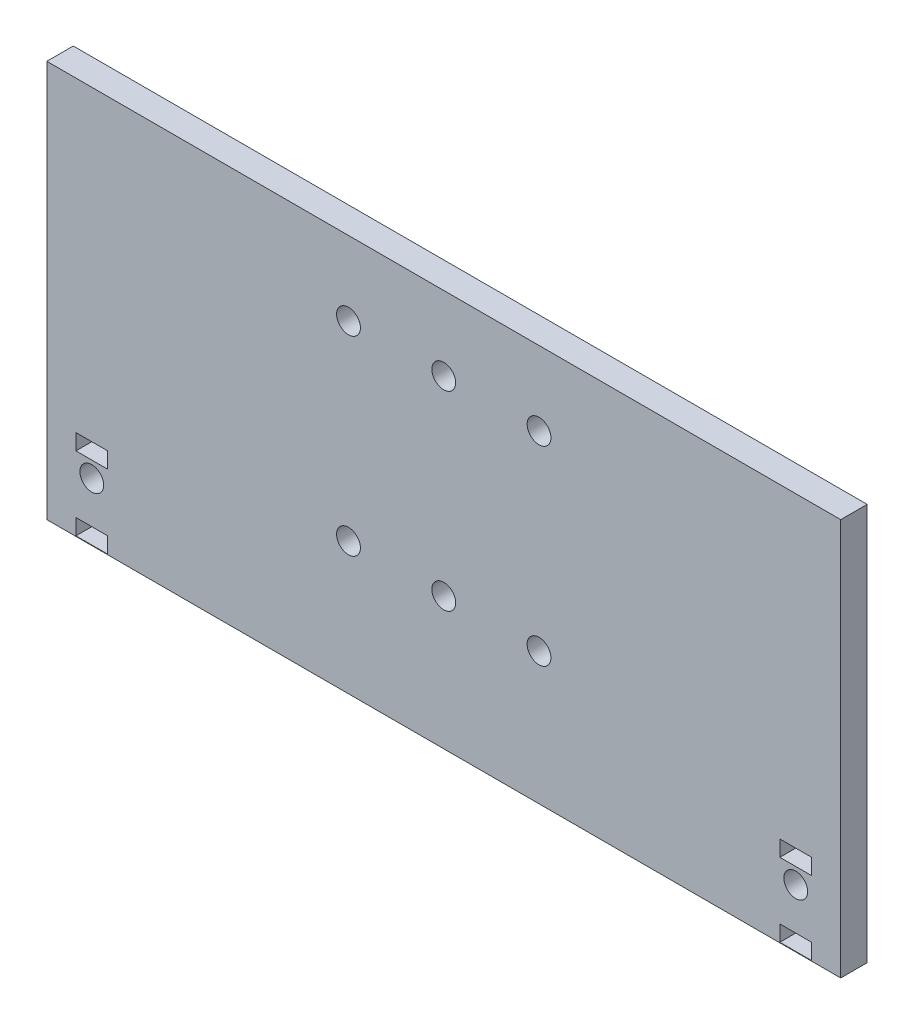
ISO-10303-21;
HEADER;
FILE_DESCRIPTION(('STEP AP214'),'2;1');
FILE_NAME('part.step','',(''),(''),'','','');
FILE_SCHEMA(('AUTOMOTIVE_DESIGN { 1 0 10303 214 1 1 1 1 }'));
ENDSEC;
DATA;
#1=APPLICATION_CONTEXT('core data for automotive mechanical design processes');
#2=APPLICATION_PROTOCOL_DEFINITION('international standard','automotive_design',2000,#1);
#3=PRODUCT_CONTEXT('',#1,'mechanical');
#4=PRODUCT('Part','Part','',(#3));
#5=PRODUCT_RELATED_PRODUCT_CATEGORY('part','',(#4));
#6=PRODUCT_DEFINITION_FORMATION('','',#4);
#7=PRODUCT_DEFINITION_CONTEXT('part definition',#1,'design');
#8=PRODUCT_DEFINITION('design','',#6,#7);
#9=PRODUCT_DEFINITION_SHAPE('','',#8);
#10=(LENGTH_UNIT() NAMED_UNIT(*) SI_UNIT(.MILLI.,.METRE.));
#11=(NAMED_UNIT(*) PLANE_ANGLE_UNIT() SI_UNIT($,.RADIAN.));
#12=(NAMED_UNIT(*) SI_UNIT($,.STERADIAN.) SOLID_ANGLE_UNIT());
#13=UNCERTAINTY_MEASURE_WITH_UNIT(LENGTH_MEASURE(1.E-05),#10,'distance_accuracy_value','');
#14=(GEOMETRIC_REPRESENTATION_CONTEXT(3) GLOBAL_UNCERTAINTY_ASSIGNED_CONTEXT((#13)) GLOBAL_UNIT_ASSIGNED_CONTEXT((#10,
#11,#12)) REPRESENTATION_CONTEXT('',''));
#15=CARTESIAN_POINT('',(0.,0.,0.));
#16=DIRECTION('',(0.,0.,1.));
#17=DIRECTION('',(1.,0.,0.));
#18=AXIS2_PLACEMENT_3D('',#15,#16,#17);
#19=CARTESIAN_POINT('',(0.,0.,5.));
#20=DIRECTION('',(0.,0.,1.));
#21=DIRECTION('',(1.,0.,0.));
#22=AXIS2_PLACEMENT_3D('',#19,#20,#21);
#23=PLANE('',#22);
#24=CARTESIAN_POINT('',(57.,-50.,5.));
#25=DIRECTION('',(0.,0.,1.));
#26=DIRECTION('',(1.,0.,0.));
#27=AXIS2_PLACEMENT_3D('',#24,#25,#26);
#28=CIRCLE('',#27,2.25);
#29=CARTESIAN_POINT('',(59.25,-50.,5.));
#30=VERTEX_POINT('',#29);
#31=EDGE_CURVE('E399',#30,#30,#28,.T.);
#32=ORIENTED_EDGE('',*,*,#31,.F.);
#33=EDGE_LOOP('',(#32));
#34=FACE_BOUND('',#33,.T.);
#35=CARTESIAN_POINT('',(93.,-14.,5.));
#36=DIRECTION('',(0.,0.,1.));
#37=DIRECTION('',(1.,0.,0.));
#38=AXIS2_PLACEMENT_3D('',#35,#36,#37);
#39=CIRCLE('',#38,2.25);
#40=CARTESIAN_POINT('',(95.25,-14.,5.));
#41=VERTEX_POINT('',#40);
#42=EDGE_CURVE('E400',#41,#41,#39,.T.);
#43=ORIENTED_EDGE('',*,*,#42,.F.);
#44=EDGE_LOOP('',(#43));
#45=FACE_BOUND('',#44,.T.);
#46=CARTESIAN_POINT('',(141.5,-64.,5.));
#47=DIRECTION('',(0.,0.,1.));
#48=DIRECTION('',(1.,0.,0.));
#49=AXIS2_PLACEMENT_3D('',#46,#47,#48);
#50=CIRCLE('',#49,2.25000000000001);
#51=CARTESIAN_POINT('',(143.75,-64.,5.));
#52=VERTEX_POINT('',#51);
#53=EDGE_CURVE('E413',#52,#52,#50,.T.);
#54=ORIENTED_EDGE('',*,*,#53,.F.);
#55=EDGE_LOOP('',(#54));
#56=FACE_BOUND('',#55,.T.);
#57=CARTESIAN_POINT('',(75.,-14.,5.));
#58=DIRECTION('',(0.,0.,1.));
#59=DIRECTION('',(1.,0.,0.));
#60=AXIS2_PLACEMENT_3D('',#57,#58,#59);
#61=CIRCLE('',#60,2.25);
#62=CARTESIAN_POINT('',(77.25,-14.,5.));
#63=VERTEX_POINT('',#62);
#64=EDGE_CURVE('E449',#63,#63,#61,.T.);
#65=ORIENTED_EDGE('',*,*,#64,.F.);
#66=EDGE_LOOP('',(#65));
#67=FACE_BOUND('',#66,.T.);
#68=DIRECTION('',(0.,-1.,0.));
#69=VECTOR('',#68,1.);
#70=CARTESIAN_POINT('',(0.,0.,5.));
#71=LINE('',#70,#69);
#72=CARTESIAN_POINT('',(0.,0.,5.));
#73=VERTEX_POINT('',#72);
#74=CARTESIAN_POINT('',(0.,-75.,5.));
#75=VERTEX_POINT('',#74);
#76=EDGE_CURVE('E458',#73,#75,#71,.T.);
#77=ORIENTED_EDGE('',*,*,#76,.T.);
#78=DIRECTION('',(1.,0.,0.));
#79=VECTOR('',#78,1.);
#80=CARTESIAN_POINT('',(0.,-75.,5.));
#81=LINE('',#80,#79);
#82=CARTESIAN_POINT('',(150.,-75.,5.));
#83=VERTEX_POINT('',#82);
#84=EDGE_CURVE('E489',#75,#83,#81,.T.);
#85=ORIENTED_EDGE('',*,*,#84,.T.);
#86=DIRECTION('',(0.,1.,0.));
#87=VECTOR('',#86,1.);
#88=CARTESIAN_POINT('',(150.,0.,5.));
#89=LINE('',#88,#87);
#90=CARTESIAN_POINT('',(150.,0.,5.));
#91=VERTEX_POINT('',#90);
#92=EDGE_CURVE('E441',#83,#91,#89,.T.);
#93=ORIENTED_EDGE('',*,*,#92,.T.);
#94=DIRECTION('',(-1.,0.,0.));
#95=VECTOR('',#94,1.);
#96=CARTESIAN_POINT('',(0.,0.,5.));
#97=LINE('',#96,#95);
#98=EDGE_CURVE('E436',#91,#73,#97,.T.);
#99=ORIENTED_EDGE('',*,*,#98,.T.);
#100=EDGE_LOOP('',(#77,#85,#93,#99));
#101=FACE_BOUND('',#100,.T.);
#102=CARTESIAN_POINT('',(8.50000000000001,-64.,5.));
#103=DIRECTION('',(0.,0.,1.));
#104=DIRECTION('',(1.,0.,0.));
#105=AXIS2_PLACEMENT_3D('',#102,#103,#104);
#106=CIRCLE('',#105,2.25000000000001);
#107=CARTESIAN_POINT('',(10.75,-64.,5.));
#108=VERTEX_POINT('',#107);
#109=EDGE_CURVE('E425',#108,#108,#106,.T.);
#110=ORIENTED_EDGE('',*,*,#109,.F.);
#111=EDGE_LOOP('',(#110));
#112=FACE_BOUND('',#111,.T.);
#113=CARTESIAN_POINT('',(57.,-14.,5.));
#114=DIRECTION('',(0.,0.,1.));
#115=DIRECTION('',(1.,0.,0.));
#116=AXIS2_PLACEMENT_3D('',#113,#114,#115);
#117=CIRCLE('',#116,2.25);
#118=CARTESIAN_POINT('',(59.25,-14.,5.));
#119=VERTEX_POINT('',#118);
#120=EDGE_CURVE('E424',#119,#119,#117,.T.);
#121=ORIENTED_EDGE('',*,*,#120,.F.);
#122=EDGE_LOOP('',(#121));
#123=FACE_BOUND('',#122,.T.);
#124=CARTESIAN_POINT('',(93.,-50.,5.));
#125=DIRECTION('',(0.,0.,1.));
#126=DIRECTION('',(1.,0.,0.));
#127=AXIS2_PLACEMENT_3D('',#124,#125,#126);
#128=CIRCLE('',#127,2.25);
#129=CARTESIAN_POINT('',(95.25,-50.,5.));
#130=VERTEX_POINT('',#129);
#131=EDGE_CURVE('E388',#130,#130,#128,.T.);
#132=ORIENTED_EDGE('',*,*,#131,.F.);
#133=EDGE_LOOP('',(#132));
#134=FACE_BOUND('',#133,.T.);
#135=CARTESIAN_POINT('',(75.,-50.,5.));
#136=DIRECTION('',(0.,0.,1.));
#137=DIRECTION('',(1.,0.,0.));
#138=AXIS2_PLACEMENT_3D('',#135,#136,#137);
#139=CIRCLE('',#138,2.25);
#140=CARTESIAN_POINT('',(77.25,-50.,5.));
#141=VERTEX_POINT('',#140);
#142=EDGE_CURVE('E376',#141,#141,#139,.T.);
#143=ORIENTED_EDGE('',*,*,#142,.F.);
#144=EDGE_LOOP('',(#143));
#145=FACE_BOUND('',#144,.T.);
#146=DIRECTION('',(1.,0.,0.));
#147=VECTOR('',#146,1.);
#148=CARTESIAN_POINT('',(5.50000000000001,-61.,5.));
#149=LINE('',#148,#147);
#150=CARTESIAN_POINT('',(5.50000000000001,-61.,5.));
#151=VERTEX_POINT('',#150);
#152=CARTESIAN_POINT('',(11.5,-61.,5.));
#153=VERTEX_POINT('',#152);
#154=EDGE_CURVE('E332',#151,#153,#149,.T.);
#155=ORIENTED_EDGE('',*,*,#154,.F.);
#156=DIRECTION('',(0.,-1.,0.));
#157=VECTOR('',#156,1.);
#158=CARTESIAN_POINT('',(5.50000000000001,-58.,5.));
#159=LINE('',#158,#157);
#160=CARTESIAN_POINT('',(5.50000000000001,-58.,5.));
#161=VERTEX_POINT('',#160);
#162=EDGE_CURVE('E328',#161,#151,#159,.T.);
#163=ORIENTED_EDGE('',*,*,#162,.F.);
#164=DIRECTION('',(-1.,0.,0.));
#165=VECTOR('',#164,1.);
#166=CARTESIAN_POINT('',(5.50000000000001,-58.,5.));
#167=LINE('',#166,#165);
#168=CARTESIAN_POINT('',(11.5,-58.,5.));
#169=VERTEX_POINT('',#168);
#170=EDGE_CURVE('E341',#169,#161,#167,.T.);
#171=ORIENTED_EDGE('',*,*,#170,.F.);
#172=DIRECTION('',(0.,1.,0.));
#173=VECTOR('',#172,1.);
#174=CARTESIAN_POINT('',(11.5,-58.,5.));
#175=LINE('',#174,#173);
#176=EDGE_CURVE('E346',#153,#169,#175,.T.);
#177=ORIENTED_EDGE('',*,*,#176,.F.);
#178=EDGE_LOOP('',(#155,#163,#171,#177));
#179=FACE_BOUND('',#178,.T.);
#180=DIRECTION('',(1.,0.,0.));
#181=VECTOR('',#180,1.);
#182=CARTESIAN_POINT('',(5.50000000000001,-74.9,5.));
#183=LINE('',#182,#181);
#184=CARTESIAN_POINT('',(5.50000000000001,-74.9,5.));
#185=VERTEX_POINT('',#184);
#186=CARTESIAN_POINT('',(11.5,-74.9,5.));
#187=VERTEX_POINT('',#186);
#188=EDGE_CURVE('E284',#185,#187,#183,.T.);
#189=ORIENTED_EDGE('',*,*,#188,.F.);
#190=DIRECTION('',(0.,-1.,0.));
#191=VECTOR('',#190,1.);
#192=CARTESIAN_POINT('',(5.50000000000001,-71.9,5.));
#193=LINE('',#192,#191);
#194=CARTESIAN_POINT('',(5.50000000000001,-71.9,5.));
#195=VERTEX_POINT('',#194);
#196=EDGE_CURVE('E280',#195,#185,#193,.T.);
#197=ORIENTED_EDGE('',*,*,#196,.F.);
#198=DIRECTION('',(-1.,0.,0.));
#199=VECTOR('',#198,1.);
#200=CARTESIAN_POINT('',(5.50000000000001,-71.9,5.));
#201=LINE('',#200,#199);
#202=CARTESIAN_POINT('',(11.5,-71.9,5.));
#203=VERTEX_POINT('',#202);
#204=EDGE_CURVE('E293',#203,#195,#201,.T.);
#205=ORIENTED_EDGE('',*,*,#204,.F.);
#206=DIRECTION('',(0.,1.,0.));
#207=VECTOR('',#206,1.);
#208=CARTESIAN_POINT('',(11.5,-71.9,5.));
#209=LINE('',#208,#207);
#210=EDGE_CURVE('E298',#187,#203,#209,.T.);
#211=ORIENTED_EDGE('',*,*,#210,.F.);
#212=EDGE_LOOP('',(#189,#197,#205,#211));
#213=FACE_BOUND('',#212,.T.);
#214=DIRECTION('',(1.,0.,0.));
#215=VECTOR('',#214,1.);
#216=CARTESIAN_POINT('',(138.5,-61.,5.));
#217=LINE('',#216,#215);
#218=CARTESIAN_POINT('',(138.5,-61.,5.));
#219=VERTEX_POINT('',#218);
#220=CARTESIAN_POINT('',(144.5,-61.,5.));
#221=VERTEX_POINT('',#220);
#222=EDGE_CURVE('E238',#219,#221,#217,.T.);
#223=ORIENTED_EDGE('',*,*,#222,.F.);
#224=DIRECTION('',(0.,-1.,0.));
#225=VECTOR('',#224,1.);
#226=CARTESIAN_POINT('',(138.5,-58.,5.));
#227=LINE('',#226,#225);
#228=CARTESIAN_POINT('',(138.5,-58.,5.));
#229=VERTEX_POINT('',#228);
#230=EDGE_CURVE('E234',#229,#219,#227,.T.);
#231=ORIENTED_EDGE('',*,*,#230,.F.);
#232=DIRECTION('',(-1.,0.,0.));
#233=VECTOR('',#232,1.);
#234=CARTESIAN_POINT('',(138.5,-58.,5.));
#235=LINE('',#234,#233);
#236=CARTESIAN_POINT('',(144.5,-58.,5.));
#237=VERTEX_POINT('',#236);
#238=EDGE_CURVE('E245',#237,#229,#235,.T.);
#239=ORIENTED_EDGE('',*,*,#238,.F.);
#240=DIRECTION('',(0.,1.,0.));
#241=VECTOR('',#240,1.);
#242=CARTESIAN_POINT('',(144.5,-58.,5.));
#243=LINE('',#242,#241);
#244=EDGE_CURVE('E250',#221,#237,#243,.T.);
#245=ORIENTED_EDGE('',*,*,#244,.F.);
#246=EDGE_LOOP('',(#223,#231,#239,#245));
#247=FACE_BOUND('',#246,.T.);
#248=DIRECTION('',(1.,0.,0.));
#249=VECTOR('',#248,1.);
#250=CARTESIAN_POINT('',(138.5,-74.9,5.));
#251=LINE('',#250,#249);
#252=CARTESIAN_POINT('',(138.5,-74.9,5.));
#253=VERTEX_POINT('',#252);
#254=CARTESIAN_POINT('',(144.5,-74.9,5.));
#255=VERTEX_POINT('',#254);
#256=EDGE_CURVE('E187',#253,#255,#251,.T.);
#257=ORIENTED_EDGE('',*,*,#256,.F.);
#258=DIRECTION('',(0.,-1.,0.));
#259=VECTOR('',#258,1.);
#260=CARTESIAN_POINT('',(138.5,-71.9,5.));
#261=LINE('',#260,#259);
#262=CARTESIAN_POINT('',(138.5,-71.9,5.));
#263=VERTEX_POINT('',#262);
#264=EDGE_CURVE('E178',#263,#253,#261,.T.);
#265=ORIENTED_EDGE('',*,*,#264,.F.);
#266=DIRECTION('',(-1.,0.,0.));
#267=VECTOR('',#266,1.);
#268=CARTESIAN_POINT('',(138.5,-71.9,5.));
#269=LINE('',#268,#267);
#270=CARTESIAN_POINT('',(144.5,-71.9,5.));
#271=VERTEX_POINT('',#270);
#272=EDGE_CURVE('E204',#271,#263,#269,.T.);
#273=ORIENTED_EDGE('',*,*,#272,.F.);
#274=DIRECTION('',(0.,1.,0.));
#275=VECTOR('',#274,1.);
#276=CARTESIAN_POINT('',(144.5,-71.9,5.));
#277=LINE('',#276,#275);
#278=EDGE_CURVE('E200',#255,#271,#277,.T.);
#279=ORIENTED_EDGE('',*,*,#278,.F.);
#280=EDGE_LOOP('',(#257,#265,#273,#279));
#281=FACE_BOUND('',#280,.T.);
#282=ADVANCED_FACE('F40',(#34,#45,#56,#67,#101,#112,#123,#134,#145,#179,#213,#247,#281),#23,.T.);
#283=CARTESIAN_POINT('',(0.,0.,0.));
#284=DIRECTION('',(0.,0.,1.));
#285=DIRECTION('',(1.,0.,0.));
#286=AXIS2_PLACEMENT_3D('',#283,#284,#285);
#287=PLANE('',#286);
#288=DIRECTION('',(0.,-1.,0.));
#289=VECTOR('',#288,1.);
#290=CARTESIAN_POINT('',(138.5,-58.,0.));
#291=LINE('',#290,#289);
#292=CARTESIAN_POINT('',(138.5,-58.,0.));
#293=VERTEX_POINT('',#292);
#294=CARTESIAN_POINT('',(138.5,-61.,0.));
#295=VERTEX_POINT('',#294);
#296=EDGE_CURVE('E196',#293,#295,#291,.T.);
#297=ORIENTED_EDGE('',*,*,#296,.T.);
#298=DIRECTION('',(1.,0.,0.));
#299=VECTOR('',#298,1.);
#300=CARTESIAN_POINT('',(138.5,-61.,0.));
#301=LINE('',#300,#299);
#302=CARTESIAN_POINT('',(144.5,-61.,0.));
#303=VERTEX_POINT('',#302);
#304=EDGE_CURVE('E255',#295,#303,#301,.T.);
#305=ORIENTED_EDGE('',*,*,#304,.T.);
#306=DIRECTION('',(0.,1.,0.));
#307=VECTOR('',#306,1.);
#308=CARTESIAN_POINT('',(144.5,-58.,0.));
#309=LINE('',#308,#307);
#310=CARTESIAN_POINT('',(144.5,-58.,0.));
#311=VERTEX_POINT('',#310);
#312=EDGE_CURVE('E259',#303,#311,#309,.T.);
#313=ORIENTED_EDGE('',*,*,#312,.T.);
#314=DIRECTION('',(-1.,0.,0.));
#315=VECTOR('',#314,1.);
#316=CARTESIAN_POINT('',(138.5,-58.,0.));
#317=LINE('',#316,#315);
#318=EDGE_CURVE('E239',#311,#293,#317,.T.);
#319=ORIENTED_EDGE('',*,*,#318,.T.);
#320=EDGE_LOOP('',(#297,#305,#313,#319));
#321=FACE_BOUND('',#320,.T.);
#322=DIRECTION('',(0.,-1.,0.));
#323=VECTOR('',#322,1.);
#324=CARTESIAN_POINT('',(5.50000000000001,-58.,0.));
#325=LINE('',#324,#323);
#326=CARTESIAN_POINT('',(5.50000000000001,-58.,0.));
#327=VERTEX_POINT('',#326);
#328=CARTESIAN_POINT('',(5.50000000000001,-61.,0.));
#329=VERTEX_POINT('',#328);
#330=EDGE_CURVE('E327',#327,#329,#325,.T.);
#331=ORIENTED_EDGE('',*,*,#330,.T.);
#332=DIRECTION('',(1.,0.,0.));
#333=VECTOR('',#332,1.);
#334=CARTESIAN_POINT('',(5.50000000000001,-61.,0.));
#335=LINE('',#334,#333);
#336=CARTESIAN_POINT('',(11.5,-61.,0.));
#337=VERTEX_POINT('',#336);
#338=EDGE_CURVE('E351',#329,#337,#335,.T.);
#339=ORIENTED_EDGE('',*,*,#338,.T.);
#340=DIRECTION('',(0.,1.,0.));
#341=VECTOR('',#340,1.);
#342=CARTESIAN_POINT('',(11.5,-58.,0.));
#343=LINE('',#342,#341);
#344=CARTESIAN_POINT('',(11.5,-58.,0.));
#345=VERTEX_POINT('',#344);
#346=EDGE_CURVE('E355',#337,#345,#343,.T.);
#347=ORIENTED_EDGE('',*,*,#346,.T.);
#348=DIRECTION('',(-1.,0.,0.));
#349=VECTOR('',#348,1.);
#350=CARTESIAN_POINT('',(5.50000000000001,-58.,0.));
#351=LINE('',#350,#349);
#352=EDGE_CURVE('E333',#345,#327,#351,.T.);
#353=ORIENTED_EDGE('',*,*,#352,.T.);
#354=EDGE_LOOP('',(#331,#339,#347,#353));
#355=FACE_BOUND('',#354,.T.);
#356=DIRECTION('',(0.,-1.,0.));
#357=VECTOR('',#356,1.);
#358=CARTESIAN_POINT('',(0.,0.,0.));
#359=LINE('',#358,#357);
#360=CARTESIAN_POINT('',(0.,0.,0.));
#361=VERTEX_POINT('',#360);
#362=CARTESIAN_POINT('',(0.,-75.,0.));
#363=VERTEX_POINT('',#362);
#364=EDGE_CURVE('E444',#361,#363,#359,.T.);
#365=ORIENTED_EDGE('',*,*,#364,.F.);
#366=DIRECTION('',(-1.,0.,0.));
#367=VECTOR('',#366,1.);
#368=CARTESIAN_POINT('',(0.,0.,0.));
#369=LINE('',#368,#367);
#370=CARTESIAN_POINT('',(150.,0.,0.));
#371=VERTEX_POINT('',#370);
#372=EDGE_CURVE('E455',#371,#361,#369,.T.);
#373=ORIENTED_EDGE('',*,*,#372,.F.);
#374=DIRECTION('',(0.,1.,0.));
#375=VECTOR('',#374,1.);
#376=CARTESIAN_POINT('',(150.,0.,0.));
#377=LINE('',#376,#375);
#378=CARTESIAN_POINT('',(150.,-75.,0.));
#379=VERTEX_POINT('',#378);
#380=EDGE_CURVE('E452',#379,#371,#377,.T.);
#381=ORIENTED_EDGE('',*,*,#380,.F.);
#382=DIRECTION('',(1.,0.,0.));
#383=VECTOR('',#382,1.);
#384=CARTESIAN_POINT('',(0.,-75.,0.));
#385=LINE('',#384,#383);
#386=EDGE_CURVE('E448',#363,#379,#385,.T.);
#387=ORIENTED_EDGE('',*,*,#386,.F.);
#388=EDGE_LOOP('',(#365,#373,#381,#387));
#389=FACE_BOUND('',#388,.T.);
#390=CARTESIAN_POINT('',(75.,-14.,0.));
#391=DIRECTION('',(0.,0.,1.));
#392=DIRECTION('',(1.,0.,0.));
#393=AXIS2_PLACEMENT_3D('',#390,#391,#392);
#394=CIRCLE('',#393,2.25);
#395=CARTESIAN_POINT('',(77.25,-14.,0.));
#396=VERTEX_POINT('',#395);
#397=EDGE_CURVE('E430',#396,#396,#394,.T.);
#398=ORIENTED_EDGE('',*,*,#397,.T.);
#399=EDGE_LOOP('',(#398));
#400=FACE_BOUND('',#399,.T.);
#401=CARTESIAN_POINT('',(8.50000000000001,-64.,0.));
#402=DIRECTION('',(0.,0.,1.));
#403=DIRECTION('',(1.,0.,0.));
#404=AXIS2_PLACEMENT_3D('',#401,#402,#403);
#405=CIRCLE('',#404,2.25000000000001);
#406=CARTESIAN_POINT('',(10.75,-64.,0.));
#407=VERTEX_POINT('',#406);
#408=EDGE_CURVE('E419',#407,#407,#405,.T.);
#409=ORIENTED_EDGE('',*,*,#408,.T.);
#410=EDGE_LOOP('',(#409));
#411=FACE_BOUND('',#410,.T.);
#412=CARTESIAN_POINT('',(141.5,-64.,0.));
#413=DIRECTION('',(0.,0.,1.));
#414=DIRECTION('',(1.,0.,0.));
#415=AXIS2_PLACEMENT_3D('',#412,#413,#414);
#416=CIRCLE('',#415,2.25000000000001);
#417=CARTESIAN_POINT('',(143.75,-64.,0.));
#418=VERTEX_POINT('',#417);
#419=EDGE_CURVE('E420',#418,#418,#416,.T.);
#420=ORIENTED_EDGE('',*,*,#419,.T.);
#421=EDGE_LOOP('',(#420));
#422=FACE_BOUND('',#421,.T.);
#423=CARTESIAN_POINT('',(57.,-14.,0.));
#424=DIRECTION('',(0.,0.,1.));
#425=DIRECTION('',(1.,0.,0.));
#426=AXIS2_PLACEMENT_3D('',#423,#424,#425);
#427=CIRCLE('',#426,2.25);
#428=CARTESIAN_POINT('',(59.25,-14.,0.));
#429=VERTEX_POINT('',#428);
#430=EDGE_CURVE('E405',#429,#429,#427,.T.);
#431=ORIENTED_EDGE('',*,*,#430,.T.);
#432=EDGE_LOOP('',(#431));
#433=FACE_BOUND('',#432,.T.);
#434=CARTESIAN_POINT('',(93.,-14.,0.));
#435=DIRECTION('',(0.,0.,1.));
#436=DIRECTION('',(1.,0.,0.));
#437=AXIS2_PLACEMENT_3D('',#434,#435,#436);
#438=CIRCLE('',#437,2.25);
#439=CARTESIAN_POINT('',(95.25,-14.,0.));
#440=VERTEX_POINT('',#439);
#441=EDGE_CURVE('E394',#440,#440,#438,.T.);
#442=ORIENTED_EDGE('',*,*,#441,.T.);
#443=EDGE_LOOP('',(#442));
#444=FACE_BOUND('',#443,.T.);
#445=CARTESIAN_POINT('',(93.,-50.,0.));
#446=DIRECTION('',(0.,0.,1.));
#447=DIRECTION('',(1.,0.,0.));
#448=AXIS2_PLACEMENT_3D('',#445,#446,#447);
#449=CIRCLE('',#448,2.25);
#450=CARTESIAN_POINT('',(95.25,-50.,0.));
#451=VERTEX_POINT('',#450);
#452=EDGE_CURVE('E395',#451,#451,#449,.T.);
#453=ORIENTED_EDGE('',*,*,#452,.T.);
#454=EDGE_LOOP('',(#453));
#455=FACE_BOUND('',#454,.T.);
#456=CARTESIAN_POINT('',(57.,-50.,0.));
#457=DIRECTION('',(0.,0.,1.));
#458=DIRECTION('',(1.,0.,0.));
#459=AXIS2_PLACEMENT_3D('',#456,#457,#458);
#460=CIRCLE('',#459,2.25);
#461=CARTESIAN_POINT('',(59.25,-50.,0.));
#462=VERTEX_POINT('',#461);
#463=EDGE_CURVE('E381',#462,#462,#460,.T.);
#464=ORIENTED_EDGE('',*,*,#463,.T.);
#465=EDGE_LOOP('',(#464));
#466=FACE_BOUND('',#465,.T.);
#467=CARTESIAN_POINT('',(75.,-50.,0.));
#468=DIRECTION('',(0.,0.,1.));
#469=DIRECTION('',(1.,0.,0.));
#470=AXIS2_PLACEMENT_3D('',#467,#468,#469);
#471=CIRCLE('',#470,2.25);
#472=CARTESIAN_POINT('',(77.25,-50.,0.));
#473=VERTEX_POINT('',#472);
#474=EDGE_CURVE('E375',#473,#473,#471,.T.);
#475=ORIENTED_EDGE('',*,*,#474,.T.);
#476=EDGE_LOOP('',(#475));
#477=FACE_BOUND('',#476,.T.);
#478=DIRECTION('',(0.,-1.,0.));
#479=VECTOR('',#478,1.);
#480=CARTESIAN_POINT('',(5.50000000000001,-71.9,0.));
#481=LINE('',#480,#479);
#482=CARTESIAN_POINT('',(5.50000000000001,-71.9,0.));
#483=VERTEX_POINT('',#482);
#484=CARTESIAN_POINT('',(5.50000000000001,-74.9,0.));
#485=VERTEX_POINT('',#484);
#486=EDGE_CURVE('E279',#483,#485,#481,.T.);
#487=ORIENTED_EDGE('',*,*,#486,.T.);
#488=DIRECTION('',(1.,0.,0.));
#489=VECTOR('',#488,1.);
#490=CARTESIAN_POINT('',(5.50000000000001,-74.9,0.));
#491=LINE('',#490,#489);
#492=CARTESIAN_POINT('',(11.5,-74.9,0.));
#493=VERTEX_POINT('',#492);
#494=EDGE_CURVE('E303',#485,#493,#491,.T.);
#495=ORIENTED_EDGE('',*,*,#494,.T.);
#496=DIRECTION('',(0.,1.,0.));
#497=VECTOR('',#496,1.);
#498=CARTESIAN_POINT('',(11.5,-71.9,0.));
#499=LINE('',#498,#497);
#500=CARTESIAN_POINT('',(11.5,-71.9,0.));
#501=VERTEX_POINT('',#500);
#502=EDGE_CURVE('E307',#493,#501,#499,.T.);
#503=ORIENTED_EDGE('',*,*,#502,.T.);
#504=DIRECTION('',(-1.,0.,0.));
#505=VECTOR('',#504,1.);
#506=CARTESIAN_POINT('',(5.50000000000001,-71.9,0.));
#507=LINE('',#506,#505);
#508=EDGE_CURVE('E285',#501,#483,#507,.T.);
#509=ORIENTED_EDGE('',*,*,#508,.T.);
#510=EDGE_LOOP('',(#487,#495,#503,#509));
#511=FACE_BOUND('',#510,.T.);
#512=DIRECTION('',(0.,-1.,0.));
#513=VECTOR('',#512,1.);
#514=CARTESIAN_POINT('',(138.5,-71.9,0.));
#515=LINE('',#514,#513);
#516=CARTESIAN_POINT('',(138.5,-71.9,0.));
#517=VERTEX_POINT('',#516);
#518=CARTESIAN_POINT('',(138.5,-74.9,0.));
#519=VERTEX_POINT('',#518);
#520=EDGE_CURVE('E64',#517,#519,#515,.T.);
#521=ORIENTED_EDGE('',*,*,#520,.T.);
#522=DIRECTION('',(1.,0.,0.));
#523=VECTOR('',#522,1.);
#524=CARTESIAN_POINT('',(138.5,-74.9,0.));
#525=LINE('',#524,#523);
#526=CARTESIAN_POINT('',(144.5,-74.9,0.));
#527=VERTEX_POINT('',#526);
#528=EDGE_CURVE('E194',#519,#527,#525,.T.);
#529=ORIENTED_EDGE('',*,*,#528,.T.);
#530=DIRECTION('',(0.,1.,0.));
#531=VECTOR('',#530,1.);
#532=CARTESIAN_POINT('',(144.5,-71.9,0.));
#533=LINE('',#532,#531);
#534=CARTESIAN_POINT('',(144.5,-71.9,0.));
#535=VERTEX_POINT('',#534);
#536=EDGE_CURVE('E221',#527,#535,#533,.T.);
#537=ORIENTED_EDGE('',*,*,#536,.T.);
#538=DIRECTION('',(-1.,0.,0.));
#539=VECTOR('',#538,1.);
#540=CARTESIAN_POINT('',(138.5,-71.9,0.));
#541=LINE('',#540,#539);
#542=EDGE_CURVE('E188',#535,#517,#541,.T.);
#543=ORIENTED_EDGE('',*,*,#542,.T.);
#544=EDGE_LOOP('',(#521,#529,#537,#543));
#545=FACE_BOUND('',#544,.T.);
#546=ADVANCED_FACE('F477',(#321,#355,#389,#400,#411,#422,#433,#444,#455,#466,#477,#511,#545),
#287,.F.);
#547=CARTESIAN_POINT('',(0.,0.,5.));
#548=DIRECTION('',(1.,0.,0.));
#549=DIRECTION('',(0.,1.,0.));
#550=AXIS2_PLACEMENT_3D('',#547,#548,#549);
#551=PLANE('',#550);
#552=ORIENTED_EDGE('',*,*,#364,.T.);
#553=DIRECTION('',(0.,0.,-1.));
#554=VECTOR('',#553,1.);
#555=CARTESIAN_POINT('',(0.,-75.,5.));
#556=LINE('',#555,#554);
#557=EDGE_CURVE('E12',#75,#363,#556,.T.);
#558=ORIENTED_EDGE('',*,*,#557,.F.);
#559=ORIENTED_EDGE('',*,*,#76,.F.);
#560=DIRECTION('',(0.,0.,-1.));
#561=VECTOR('',#560,1.);
#562=CARTESIAN_POINT('',(0.,0.,5.));
#563=LINE('',#562,#561);
#564=EDGE_CURVE('E440',#73,#361,#563,.T.);
#565=ORIENTED_EDGE('',*,*,#564,.T.);
#566=EDGE_LOOP('',(#552,#558,#559,#565));
#567=FACE_BOUND('',#566,.T.);
#568=ADVANCED_FACE('F42',(#567),#551,.F.);
#569=CARTESIAN_POINT('',(0.,-75.,5.));
#570=DIRECTION('',(0.,1.,0.));
#571=DIRECTION('',(0.,0.,1.));
#572=AXIS2_PLACEMENT_3D('',#569,#570,#571);
#573=PLANE('',#572);
#574=ORIENTED_EDGE('',*,*,#386,.T.);
#575=DIRECTION('',(0.,0.,-1.));
#576=VECTOR('',#575,1.);
#577=CARTESIAN_POINT('',(150.,-75.,5.));
#578=LINE('',#577,#576);
#579=EDGE_CURVE('E49',#83,#379,#578,.T.);
#580=ORIENTED_EDGE('',*,*,#579,.F.);
#581=ORIENTED_EDGE('',*,*,#84,.F.);
#582=ORIENTED_EDGE('',*,*,#557,.T.);
#583=EDGE_LOOP('',(#574,#580,#581,#582));
#584=FACE_BOUND('',#583,.T.);
#585=ADVANCED_FACE('F625',(#584),#573,.F.);
#586=CARTESIAN_POINT('',(150.,0.,5.));
#587=DIRECTION('',(-1.,0.,0.));
#588=DIRECTION('',(0.,0.,1.));
#589=AXIS2_PLACEMENT_3D('',#586,#587,#588);
#590=PLANE('',#589);
#591=ORIENTED_EDGE('',*,*,#380,.T.);
#592=DIRECTION('',(0.,0.,-1.));
#593=VECTOR('',#592,1.);
#594=CARTESIAN_POINT('',(150.,0.,5.));
#595=LINE('',#594,#593);
#596=EDGE_CURVE('E462',#91,#371,#595,.T.);
#597=ORIENTED_EDGE('',*,*,#596,.F.);
#598=ORIENTED_EDGE('',*,*,#92,.F.);
#599=ORIENTED_EDGE('',*,*,#579,.T.);
#600=EDGE_LOOP('',(#591,#597,#598,#599));
#601=FACE_BOUND('',#600,.T.);
#602=ADVANCED_FACE('F471',(#601),#590,.F.);
#603=CARTESIAN_POINT('',(0.,0.,5.));
#604=DIRECTION('',(0.,-1.,0.));
#605=DIRECTION('',(0.,0.,-1.));
#606=AXIS2_PLACEMENT_3D('',#603,#604,#605);
#607=PLANE('',#606);
#608=ORIENTED_EDGE('',*,*,#372,.T.);
#609=ORIENTED_EDGE('',*,*,#564,.F.);
#610=ORIENTED_EDGE('',*,*,#98,.F.);
#611=ORIENTED_EDGE('',*,*,#596,.T.);
#612=EDGE_LOOP('',(#608,#609,#610,#611));
#613=FACE_BOUND('',#612,.T.);
#614=ADVANCED_FACE('F481',(#613),#607,.F.);
#615=CARTESIAN_POINT('',(75.,-14.,5.));
#616=DIRECTION('',(0.,0.,-1.));
#617=DIRECTION('',(-1.,0.,0.));
#618=AXIS2_PLACEMENT_3D('',#615,#616,#617);
#619=CYLINDRICAL_SURFACE('',#618,2.25);
#620=ORIENTED_EDGE('',*,*,#64,.T.);
#621=EDGE_LOOP('',(#620));
#622=FACE_BOUND('',#621,.T.);
#623=ORIENTED_EDGE('',*,*,#397,.F.);
#624=EDGE_LOOP('',(#623));
#625=FACE_BOUND('',#624,.T.);
#626=ADVANCED_FACE('F502',(#622,#625),#619,.F.);
#627=CARTESIAN_POINT('',(8.50000000000001,-64.,5.));
#628=DIRECTION('',(0.,0.,-1.));
#629=DIRECTION('',(-1.,0.,0.));
#630=AXIS2_PLACEMENT_3D('',#627,#628,#629);
#631=CYLINDRICAL_SURFACE('',#630,2.25000000000001);
#632=ORIENTED_EDGE('',*,*,#109,.T.);
#633=EDGE_LOOP('',(#632));
#634=FACE_BOUND('',#633,.T.);
#635=ORIENTED_EDGE('',*,*,#408,.F.);
#636=EDGE_LOOP('',(#635));
#637=FACE_BOUND('',#636,.T.);
#638=ADVANCED_FACE('F613',(#634,#637),#631,.F.);
#639=CARTESIAN_POINT('',(141.5,-64.,5.));
#640=DIRECTION('',(0.,0.,-1.));
#641=DIRECTION('',(-1.,0.,0.));
#642=AXIS2_PLACEMENT_3D('',#639,#640,#641);
#643=CYLINDRICAL_SURFACE('',#642,2.25000000000001);
#644=ORIENTED_EDGE('',*,*,#53,.T.);
#645=EDGE_LOOP('',(#644));
#646=FACE_BOUND('',#645,.T.);
#647=ORIENTED_EDGE('',*,*,#419,.F.);
#648=EDGE_LOOP('',(#647));
#649=FACE_BOUND('',#648,.T.);
#650=ADVANCED_FACE('F609',(#646,#649),#643,.F.);
#651=CARTESIAN_POINT('',(57.,-14.,5.));
#652=DIRECTION('',(0.,0.,-1.));
#653=DIRECTION('',(-1.,0.,0.));
#654=AXIS2_PLACEMENT_3D('',#651,#652,#653);
#655=CYLINDRICAL_SURFACE('',#654,2.25);
#656=ORIENTED_EDGE('',*,*,#120,.T.);
#657=EDGE_LOOP('',(#656));
#658=FACE_BOUND('',#657,.T.);
#659=ORIENTED_EDGE('',*,*,#430,.F.);
#660=EDGE_LOOP('',(#659));
#661=FACE_BOUND('',#660,.T.);
#662=ADVANCED_FACE('F605',(#658,#661),#655,.F.);
#663=CARTESIAN_POINT('',(93.,-14.,5.));
#664=DIRECTION('',(0.,0.,-1.));
#665=DIRECTION('',(-1.,0.,0.));
#666=AXIS2_PLACEMENT_3D('',#663,#664,#665);
#667=CYLINDRICAL_SURFACE('',#666,2.25);
#668=ORIENTED_EDGE('',*,*,#42,.T.);
#669=EDGE_LOOP('',(#668));
#670=FACE_BOUND('',#669,.T.);
#671=ORIENTED_EDGE('',*,*,#441,.F.);
#672=EDGE_LOOP('',(#671));
#673=FACE_BOUND('',#672,.T.);
#674=ADVANCED_FACE('F601',(#670,#673),#667,.F.);
#675=CARTESIAN_POINT('',(93.,-50.,5.));
#676=DIRECTION('',(0.,0.,-1.));
#677=DIRECTION('',(-1.,0.,0.));
#678=AXIS2_PLACEMENT_3D('',#675,#676,#677);
#679=CYLINDRICAL_SURFACE('',#678,2.25);
#680=ORIENTED_EDGE('',*,*,#131,.T.);
#681=EDGE_LOOP('',(#680));
#682=FACE_BOUND('',#681,.T.);
#683=ORIENTED_EDGE('',*,*,#452,.F.);
#684=EDGE_LOOP('',(#683));
#685=FACE_BOUND('',#684,.T.);
#686=ADVANCED_FACE('F597',(#682,#685),#679,.F.);
#687=CARTESIAN_POINT('',(57.,-50.,5.));
#688=DIRECTION('',(0.,0.,-1.));
#689=DIRECTION('',(-1.,0.,0.));
#690=AXIS2_PLACEMENT_3D('',#687,#688,#689);
#691=CYLINDRICAL_SURFACE('',#690,2.25);
#692=ORIENTED_EDGE('',*,*,#31,.T.);
#693=EDGE_LOOP('',(#692));
#694=FACE_BOUND('',#693,.T.);
#695=ORIENTED_EDGE('',*,*,#463,.F.);
#696=EDGE_LOOP('',(#695));
#697=FACE_BOUND('',#696,.T.);
#698=ADVANCED_FACE('F593',(#694,#697),#691,.F.);
#699=CARTESIAN_POINT('',(75.,-50.,5.));
#700=DIRECTION('',(0.,0.,-1.));
#701=DIRECTION('',(-1.,0.,0.));
#702=AXIS2_PLACEMENT_3D('',#699,#700,#701);
#703=CYLINDRICAL_SURFACE('',#702,2.25);
#704=ORIENTED_EDGE('',*,*,#142,.T.);
#705=EDGE_LOOP('',(#704));
#706=FACE_BOUND('',#705,.T.);
#707=ORIENTED_EDGE('',*,*,#474,.F.);
#708=EDGE_LOOP('',(#707));
#709=FACE_BOUND('',#708,.T.);
#710=ADVANCED_FACE('F589',(#706,#709),#703,.F.);
#711=CARTESIAN_POINT('',(5.50000000000001,-58.,5.));
#712=DIRECTION('',(1.,0.,0.));
#713=DIRECTION('',(0.,0.,-1.));
#714=AXIS2_PLACEMENT_3D('',#711,#712,#713);
#715=PLANE('',#714);
#716=ORIENTED_EDGE('',*,*,#330,.F.);
#717=DIRECTION('',(0.,0.,-1.));
#718=VECTOR('',#717,1.);
#719=CARTESIAN_POINT('',(5.50000000000001,-58.,5.));
#720=LINE('',#719,#718);
#721=EDGE_CURVE('E345',#161,#327,#720,.T.);
#722=ORIENTED_EDGE('',*,*,#721,.F.);
#723=ORIENTED_EDGE('',*,*,#162,.T.);
#724=DIRECTION('',(0.,0.,-1.));
#725=VECTOR('',#724,1.);
#726=CARTESIAN_POINT('',(5.50000000000001,-61.,5.));
#727=LINE('',#726,#725);
#728=EDGE_CURVE('E371',#151,#329,#727,.T.);
#729=ORIENTED_EDGE('',*,*,#728,.T.);
#730=EDGE_LOOP('',(#716,#722,#723,#729));
#731=FACE_BOUND('',#730,.T.);
#732=ADVANCED_FACE('F585',(#731),#715,.T.);
#733=CARTESIAN_POINT('',(5.50000000000001,-61.,5.));
#734=DIRECTION('',(0.,1.,0.));
#735=DIRECTION('',(0.,0.,1.));
#736=AXIS2_PLACEMENT_3D('',#733,#734,#735);
#737=PLANE('',#736);
#738=ORIENTED_EDGE('',*,*,#338,.F.);
#739=ORIENTED_EDGE('',*,*,#728,.F.);
#740=ORIENTED_EDGE('',*,*,#154,.T.);
#741=DIRECTION('',(0.,0.,-1.));
#742=VECTOR('',#741,1.);
#743=CARTESIAN_POINT('',(11.5,-61.,5.));
#744=LINE('',#743,#742);
#745=EDGE_CURVE('E368',#153,#337,#744,.T.);
#746=ORIENTED_EDGE('',*,*,#745,.T.);
#747=EDGE_LOOP('',(#738,#739,#740,#746));
#748=FACE_BOUND('',#747,.T.);
#749=ADVANCED_FACE('F581',(#748),#737,.T.);
#750=CARTESIAN_POINT('',(11.5,-58.,5.));
#751=DIRECTION('',(-1.,0.,0.));
#752=DIRECTION('',(0.,0.,1.));
#753=AXIS2_PLACEMENT_3D('',#750,#751,#752);
#754=PLANE('',#753);
#755=ORIENTED_EDGE('',*,*,#346,.F.);
#756=ORIENTED_EDGE('',*,*,#745,.F.);
#757=ORIENTED_EDGE('',*,*,#176,.T.);
#758=DIRECTION('',(0.,0.,-1.));
#759=VECTOR('',#758,1.);
#760=CARTESIAN_POINT('',(11.5,-58.,5.));
#761=LINE('',#760,#759);
#762=EDGE_CURVE('E365',#169,#345,#761,.T.);
#763=ORIENTED_EDGE('',*,*,#762,.T.);
#764=EDGE_LOOP('',(#755,#756,#757,#763));
#765=FACE_BOUND('',#764,.T.);
#766=ADVANCED_FACE('F577',(#765),#754,.T.);
#767=CARTESIAN_POINT('',(5.50000000000001,-58.,5.));
#768=DIRECTION('',(0.,-1.,0.));
#769=DIRECTION('',(0.,0.,-1.));
#770=AXIS2_PLACEMENT_3D('',#767,#768,#769);
#771=PLANE('',#770);
#772=ORIENTED_EDGE('',*,*,#352,.F.);
#773=ORIENTED_EDGE('',*,*,#762,.F.);
#774=ORIENTED_EDGE('',*,*,#170,.T.);
#775=ORIENTED_EDGE('',*,*,#721,.T.);
#776=EDGE_LOOP('',(#772,#773,#774,#775));
#777=FACE_BOUND('',#776,.T.);
#778=ADVANCED_FACE('F573',(#777),#771,.T.);
#779=CARTESIAN_POINT('',(5.50000000000001,-71.9,5.));
#780=DIRECTION('',(1.,0.,0.));
#781=DIRECTION('',(0.,0.,-1.));
#782=AXIS2_PLACEMENT_3D('',#779,#780,#781);
#783=PLANE('',#782);
#784=ORIENTED_EDGE('',*,*,#486,.F.);
#785=DIRECTION('',(0.,0.,-1.));
#786=VECTOR('',#785,1.);
#787=CARTESIAN_POINT('',(5.50000000000001,-71.9,5.));
#788=LINE('',#787,#786);
#789=EDGE_CURVE('E297',#195,#483,#788,.T.);
#790=ORIENTED_EDGE('',*,*,#789,.F.);
#791=ORIENTED_EDGE('',*,*,#196,.T.);
#792=DIRECTION('',(0.,0.,-1.));
#793=VECTOR('',#792,1.);
#794=CARTESIAN_POINT('',(5.50000000000001,-74.9,5.));
#795=LINE('',#794,#793);
#796=EDGE_CURVE('E323',#185,#485,#795,.T.);
#797=ORIENTED_EDGE('',*,*,#796,.T.);
#798=EDGE_LOOP('',(#784,#790,#791,#797));
#799=FACE_BOUND('',#798,.T.);
#800=ADVANCED_FACE('F569',(#799),#783,.T.);
#801=CARTESIAN_POINT('',(5.50000000000001,-74.9,5.));
#802=DIRECTION('',(0.,1.,0.));
#803=DIRECTION('',(0.,0.,1.));
#804=AXIS2_PLACEMENT_3D('',#801,#802,#803);
#805=PLANE('',#804);
#806=ORIENTED_EDGE('',*,*,#494,.F.);
#807=ORIENTED_EDGE('',*,*,#796,.F.);
#808=ORIENTED_EDGE('',*,*,#188,.T.);
#809=DIRECTION('',(0.,0.,-1.));
#810=VECTOR('',#809,1.);
#811=CARTESIAN_POINT('',(11.5,-74.9,5.));
#812=LINE('',#811,#810);
#813=EDGE_CURVE('E320',#187,#493,#812,.T.);
#814=ORIENTED_EDGE('',*,*,#813,.T.);
#815=EDGE_LOOP('',(#806,#807,#808,#814));
#816=FACE_BOUND('',#815,.T.);
#817=ADVANCED_FACE('F565',(#816),#805,.T.);
#818=CARTESIAN_POINT('',(11.5,-71.9,5.));
#819=DIRECTION('',(-1.,0.,0.));
#820=DIRECTION('',(0.,0.,1.));
#821=AXIS2_PLACEMENT_3D('',#818,#819,#820);
#822=PLANE('',#821);
#823=ORIENTED_EDGE('',*,*,#502,.F.);
#824=ORIENTED_EDGE('',*,*,#813,.F.);
#825=ORIENTED_EDGE('',*,*,#210,.T.);
#826=DIRECTION('',(0.,0.,-1.));
#827=VECTOR('',#826,1.);
#828=CARTESIAN_POINT('',(11.5,-71.9,5.));
#829=LINE('',#828,#827);
#830=EDGE_CURVE('E317',#203,#501,#829,.T.);
#831=ORIENTED_EDGE('',*,*,#830,.T.);
#832=EDGE_LOOP('',(#823,#824,#825,#831));
#833=FACE_BOUND('',#832,.T.);
#834=ADVANCED_FACE('F561',(#833),#822,.T.);
#835=CARTESIAN_POINT('',(5.50000000000001,-71.9,5.));
#836=DIRECTION('',(0.,-1.,0.));
#837=DIRECTION('',(1.,0.,0.));
#838=AXIS2_PLACEMENT_3D('',#835,#836,#837);
#839=PLANE('',#838);
#840=ORIENTED_EDGE('',*,*,#508,.F.);
#841=ORIENTED_EDGE('',*,*,#830,.F.);
#842=ORIENTED_EDGE('',*,*,#204,.T.);
#843=ORIENTED_EDGE('',*,*,#789,.T.);
#844=EDGE_LOOP('',(#840,#841,#842,#843));
#845=FACE_BOUND('',#844,.T.);
#846=ADVANCED_FACE('F555',(#845),#839,.T.);
#847=CARTESIAN_POINT('',(138.5,-58.,5.));
#848=DIRECTION('',(1.,0.,0.));
#849=DIRECTION('',(0.,0.,-1.));
#850=AXIS2_PLACEMENT_3D('',#847,#848,#849);
#851=PLANE('',#850);
#852=ORIENTED_EDGE('',*,*,#296,.F.);
#853=DIRECTION('',(0.,0.,-1.));
#854=VECTOR('',#853,1.);
#855=CARTESIAN_POINT('',(138.5,-58.,5.));
#856=LINE('',#855,#854);
#857=EDGE_CURVE('E249',#229,#293,#856,.T.);
#858=ORIENTED_EDGE('',*,*,#857,.F.);
#859=ORIENTED_EDGE('',*,*,#230,.T.);
#860=DIRECTION('',(0.,0.,-1.));
#861=VECTOR('',#860,1.);
#862=CARTESIAN_POINT('',(138.5,-61.,5.));
#863=LINE('',#862,#861);
#864=EDGE_CURVE('E275',#219,#295,#863,.T.);
#865=ORIENTED_EDGE('',*,*,#864,.T.);
#866=EDGE_LOOP('',(#852,#858,#859,#865));
#867=FACE_BOUND('',#866,.T.);
#868=ADVANCED_FACE('F544',(#867),#851,.T.);
#869=CARTESIAN_POINT('',(138.5,-61.,5.));
#870=DIRECTION('',(0.,1.,0.));
#871=DIRECTION('',(0.,0.,1.));
#872=AXIS2_PLACEMENT_3D('',#869,#870,#871);
#873=PLANE('',#872);
#874=ORIENTED_EDGE('',*,*,#304,.F.);
#875=ORIENTED_EDGE('',*,*,#864,.F.);
#876=ORIENTED_EDGE('',*,*,#222,.T.);
#877=DIRECTION('',(0.,0.,-1.));
#878=VECTOR('',#877,1.);
#879=CARTESIAN_POINT('',(144.5,-61.,5.));
#880=LINE('',#879,#878);
#881=EDGE_CURVE('E272',#221,#303,#880,.T.);
#882=ORIENTED_EDGE('',*,*,#881,.T.);
#883=EDGE_LOOP('',(#874,#875,#876,#882));
#884=FACE_BOUND('',#883,.T.);
#885=ADVANCED_FACE('F547',(#884),#873,.T.);
#886=CARTESIAN_POINT('',(144.5,-58.,5.));
#887=DIRECTION('',(-1.,0.,0.));
#888=DIRECTION('',(0.,0.,1.));
#889=AXIS2_PLACEMENT_3D('',#886,#887,#888);
#890=PLANE('',#889);
#891=ORIENTED_EDGE('',*,*,#312,.F.);
#892=ORIENTED_EDGE('',*,*,#881,.F.);
#893=ORIENTED_EDGE('',*,*,#244,.T.);
#894=DIRECTION('',(0.,0.,-1.));
#895=VECTOR('',#894,1.);
#896=CARTESIAN_POINT('',(144.5,-58.,5.));
#897=LINE('',#896,#895);
#898=EDGE_CURVE('E269',#237,#311,#897,.T.);
#899=ORIENTED_EDGE('',*,*,#898,.T.);
#900=EDGE_LOOP('',(#891,#892,#893,#899));
#901=FACE_BOUND('',#900,.T.);
#902=ADVANCED_FACE('F538',(#901),#890,.T.);
#903=CARTESIAN_POINT('',(138.5,-58.,5.));
#904=DIRECTION('',(0.,-1.,0.));
#905=DIRECTION('',(0.,0.,-1.));
#906=AXIS2_PLACEMENT_3D('',#903,#904,#905);
#907=PLANE('',#906);
#908=ORIENTED_EDGE('',*,*,#318,.F.);
#909=ORIENTED_EDGE('',*,*,#898,.F.);
#910=ORIENTED_EDGE('',*,*,#238,.T.);
#911=ORIENTED_EDGE('',*,*,#857,.T.);
#912=EDGE_LOOP('',(#908,#909,#910,#911));
#913=FACE_BOUND('',#912,.T.);
#914=ADVANCED_FACE('F542',(#913),#907,.T.);
#915=CARTESIAN_POINT('',(138.5,-71.9,5.));
#916=DIRECTION('',(1.,0.,0.));
#917=DIRECTION('',(0.,1.,0.));
#918=AXIS2_PLACEMENT_3D('',#915,#916,#917);
#919=PLANE('',#918);
#920=ORIENTED_EDGE('',*,*,#520,.F.);
#921=DIRECTION('',(0.,0.,-1.));
#922=VECTOR('',#921,1.);
#923=CARTESIAN_POINT('',(138.5,-71.9,5.));
#924=LINE('',#923,#922);
#925=EDGE_CURVE('E182',#263,#517,#924,.T.);
#926=ORIENTED_EDGE('',*,*,#925,.F.);
#927=ORIENTED_EDGE('',*,*,#264,.T.);
#928=DIRECTION('',(0.,0.,-1.));
#929=VECTOR('',#928,1.);
#930=CARTESIAN_POINT('',(138.5,-74.9,5.));
#931=LINE('',#930,#929);
#932=EDGE_CURVE('E181',#253,#519,#931,.T.);
#933=ORIENTED_EDGE('',*,*,#932,.T.);
#934=EDGE_LOOP('',(#920,#926,#927,#933));
#935=FACE_BOUND('',#934,.T.);
#936=ADVANCED_FACE('F180',(#935),#919,.T.);
#937=CARTESIAN_POINT('',(138.5,-74.9,5.));
#938=DIRECTION('',(0.,1.,0.));
#939=DIRECTION('',(0.,0.,1.));
#940=AXIS2_PLACEMENT_3D('',#937,#938,#939);
#941=PLANE('',#940);
#942=ORIENTED_EDGE('',*,*,#528,.F.);
#943=ORIENTED_EDGE('',*,*,#932,.F.);
#944=ORIENTED_EDGE('',*,*,#256,.T.);
#945=DIRECTION('',(0.,0.,-1.));
#946=VECTOR('',#945,1.);
#947=CARTESIAN_POINT('',(144.5,-74.9,5.));
#948=LINE('',#947,#946);
#949=EDGE_CURVE('E197',#255,#527,#948,.T.);
#950=ORIENTED_EDGE('',*,*,#949,.T.);
#951=EDGE_LOOP('',(#942,#943,#944,#950));
#952=FACE_BOUND('',#951,.T.);
#953=ADVANCED_FACE('F191',(#952),#941,.T.);
#954=CARTESIAN_POINT('',(144.5,-71.9,5.));
#955=DIRECTION('',(-1.,0.,0.));
#956=DIRECTION('',(0.,0.,1.));
#957=AXIS2_PLACEMENT_3D('',#954,#955,#956);
#958=PLANE('',#957);
#959=ORIENTED_EDGE('',*,*,#536,.F.);
#960=ORIENTED_EDGE('',*,*,#949,.F.);
#961=ORIENTED_EDGE('',*,*,#278,.T.);
#962=DIRECTION('',(0.,0.,-1.));
#963=VECTOR('',#962,1.);
#964=CARTESIAN_POINT('',(144.5,-71.9,5.));
#965=LINE('',#964,#963);
#966=EDGE_CURVE('E56',#271,#535,#965,.T.);
#967=ORIENTED_EDGE('',*,*,#966,.T.);
#968=EDGE_LOOP('',(#959,#960,#961,#967));
#969=FACE_BOUND('',#968,.T.);
#970=ADVANCED_FACE('F776',(#969),#958,.T.);
#971=CARTESIAN_POINT('',(138.5,-71.9,5.));
#972=DIRECTION('',(0.,-1.,0.));
#973=DIRECTION('',(0.,0.,-1.));
#974=AXIS2_PLACEMENT_3D('',#971,#972,#973);
#975=PLANE('',#974);
#976=ORIENTED_EDGE('',*,*,#542,.F.);
#977=ORIENTED_EDGE('',*,*,#966,.F.);
#978=ORIENTED_EDGE('',*,*,#272,.T.);
#979=ORIENTED_EDGE('',*,*,#925,.T.);
#980=EDGE_LOOP('',(#976,#977,#978,#979));
#981=FACE_BOUND('',#980,.T.);
#982=ADVANCED_FACE('F784',(#981),#975,.T.);
#983=CLOSED_SHELL('',(#282,#546,#568,#585,#602,#614,#626,#638,#650,#662,#674,#686,#698,#710,
#732,#749,#766,#778,#800,#817,#834,#846,#868,#885,#902,#914,#936,#953,#970,#982));
#984=MANIFOLD_SOLID_BREP('B2',#983);
#985=ADVANCED_BREP_SHAPE_REPRESENTATION('',(#18,#984),#14);
#986=SHAPE_DEFINITION_REPRESENTATION(#9,#985);
ENDSEC;
END-ISO-10303-21;
